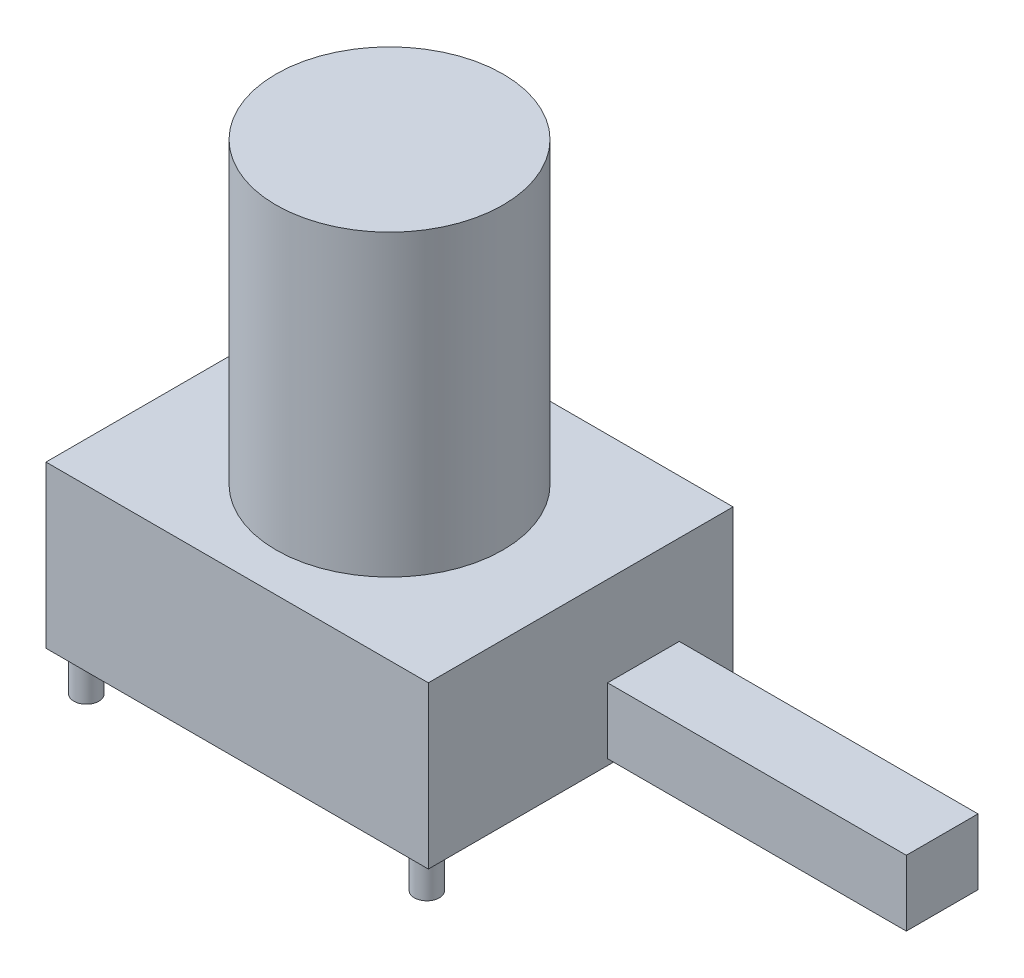
ISO-10303-21;
HEADER;
FILE_DESCRIPTION(('STEP AP214'),'2;1');
FILE_NAME('part.step','',(''),(''),'','','');
FILE_SCHEMA(('AUTOMOTIVE_DESIGN { 1 0 10303 214 1 1 1 1 }'));
ENDSEC;
DATA;
#1=APPLICATION_CONTEXT('core data for automotive mechanical design processes');
#2=APPLICATION_PROTOCOL_DEFINITION('international standard','automotive_design',2000,#1);
#3=PRODUCT_CONTEXT('',#1,'mechanical');
#4=PRODUCT('Part','Part','',(#3));
#5=PRODUCT_RELATED_PRODUCT_CATEGORY('part','',(#4));
#6=PRODUCT_DEFINITION_FORMATION('','',#4);
#7=PRODUCT_DEFINITION_CONTEXT('part definition',#1,'design');
#8=PRODUCT_DEFINITION('design','',#6,#7);
#9=PRODUCT_DEFINITION_SHAPE('','',#8);
#10=(LENGTH_UNIT() NAMED_UNIT(*) SI_UNIT(.MILLI.,.METRE.));
#11=(NAMED_UNIT(*) PLANE_ANGLE_UNIT() SI_UNIT($,.RADIAN.));
#12=(NAMED_UNIT(*) SI_UNIT($,.STERADIAN.) SOLID_ANGLE_UNIT());
#13=UNCERTAINTY_MEASURE_WITH_UNIT(LENGTH_MEASURE(1.E-05),#10,'distance_accuracy_value','');
#14=(GEOMETRIC_REPRESENTATION_CONTEXT(3) GLOBAL_UNCERTAINTY_ASSIGNED_CONTEXT((#13)) GLOBAL_UNIT_ASSIGNED_CONTEXT((#10,
#11,#12)) REPRESENTATION_CONTEXT('',''));
#15=CARTESIAN_POINT('',(0.,0.,0.));
#16=DIRECTION('',(0.,0.,1.));
#17=DIRECTION('',(1.,0.,0.));
#18=AXIS2_PLACEMENT_3D('',#15,#16,#17);
#19=CARTESIAN_POINT('',(64.,27.,0.));
#20=DIRECTION('',(-1.,0.,0.));
#21=DIRECTION('',(0.,0.,1.));
#22=AXIS2_PLACEMENT_3D('',#19,#20,#21);
#23=PLANE('',#22);
#24=DIRECTION('',(0.,0.,-1.));
#25=VECTOR('',#24,1.);
#26=CARTESIAN_POINT('',(64.,0.,0.));
#27=LINE('',#26,#25);
#28=CARTESIAN_POINT('',(64.,0.,0.));
#29=VERTEX_POINT('',#28);
#30=CARTESIAN_POINT('',(64.,0.,-51.));
#31=VERTEX_POINT('',#30);
#32=EDGE_CURVE('E180',#29,#31,#27,.T.);
#33=ORIENTED_EDGE('',*,*,#32,.T.);
#34=DIRECTION('',(0.,-1.,0.));
#35=VECTOR('',#34,1.);
#36=CARTESIAN_POINT('',(64.,27.,-51.));
#37=LINE('',#36,#35);
#38=CARTESIAN_POINT('',(64.,27.,-51.));
#39=VERTEX_POINT('',#38);
#40=EDGE_CURVE('E185',#39,#31,#37,.T.);
#41=ORIENTED_EDGE('',*,*,#40,.F.);
#42=DIRECTION('',(0.,0.,-1.));
#43=VECTOR('',#42,1.);
#44=CARTESIAN_POINT('',(64.,27.,0.));
#45=LINE('',#44,#43);
#46=CARTESIAN_POINT('',(64.,27.,0.));
#47=VERTEX_POINT('',#46);
#48=EDGE_CURVE('E171',#47,#39,#45,.T.);
#49=ORIENTED_EDGE('',*,*,#48,.F.);
#50=DIRECTION('',(0.,-1.,0.));
#51=VECTOR('',#50,1.);
#52=CARTESIAN_POINT('',(64.,27.,0.));
#53=LINE('',#52,#51);
#54=EDGE_CURVE('E188',#47,#29,#53,.T.);
#55=ORIENTED_EDGE('',*,*,#54,.T.);
#56=EDGE_LOOP('',(#33,#41,#49,#55));
#57=FACE_BOUND('',#56,.T.);
#58=DIRECTION('',(0.,1.,0.));
#59=VECTOR('',#58,1.);
#60=CARTESIAN_POINT('',(64.,1.,-42.));
#61=LINE('',#60,#59);
#62=CARTESIAN_POINT('',(64.,1.,-42.));
#63=VERTEX_POINT('',#62);
#64=CARTESIAN_POINT('',(64.,12.,-42.));
#65=VERTEX_POINT('',#64);
#66=EDGE_CURVE('E131',#63,#65,#61,.T.);
#67=ORIENTED_EDGE('',*,*,#66,.F.);
#68=DIRECTION('',(0.,0.,-1.));
#69=VECTOR('',#68,1.);
#70=CARTESIAN_POINT('',(64.,1.,-42.));
#71=LINE('',#70,#69);
#72=CARTESIAN_POINT('',(64.,1.,-30.));
#73=VERTEX_POINT('',#72);
#74=EDGE_CURVE('E128',#73,#63,#71,.T.);
#75=ORIENTED_EDGE('',*,*,#74,.F.);
#76=DIRECTION('',(0.,-1.,0.));
#77=VECTOR('',#76,1.);
#78=CARTESIAN_POINT('',(64.,0.999999999999999,-30.));
#79=LINE('',#78,#77);
#80=CARTESIAN_POINT('',(64.,12.,-30.));
#81=VERTEX_POINT('',#80);
#82=EDGE_CURVE('E66',#81,#73,#79,.T.);
#83=ORIENTED_EDGE('',*,*,#82,.F.);
#84=DIRECTION('',(0.,0.,1.));
#85=VECTOR('',#84,1.);
#86=CARTESIAN_POINT('',(64.,12.,-42.));
#87=LINE('',#86,#85);
#88=EDGE_CURVE('E61',#65,#81,#87,.T.);
#89=ORIENTED_EDGE('',*,*,#88,.F.);
#90=EDGE_LOOP('',(#67,#75,#83,#89));
#91=FACE_BOUND('',#90,.T.);
#92=ADVANCED_FACE('F46',(#57,#91),#23,.F.);
#93=CARTESIAN_POINT('',(0.,27.,0.));
#94=DIRECTION('',(1.,0.,0.));
#95=DIRECTION('',(0.,0.,-1.));
#96=AXIS2_PLACEMENT_3D('',#93,#94,#95);
#97=PLANE('',#96);
#98=DIRECTION('',(0.,0.,1.));
#99=VECTOR('',#98,1.);
#100=CARTESIAN_POINT('',(0.,0.,0.));
#101=LINE('',#100,#99);
#102=CARTESIAN_POINT('',(0.,0.,-51.));
#103=VERTEX_POINT('',#102);
#104=CARTESIAN_POINT('',(0.,0.,0.));
#105=VERTEX_POINT('',#104);
#106=EDGE_CURVE('E164',#103,#105,#101,.T.);
#107=ORIENTED_EDGE('',*,*,#106,.T.);
#108=DIRECTION('',(0.,-1.,0.));
#109=VECTOR('',#108,1.);
#110=CARTESIAN_POINT('',(0.,27.,0.));
#111=LINE('',#110,#109);
#112=CARTESIAN_POINT('',(0.,27.,0.));
#113=VERTEX_POINT('',#112);
#114=EDGE_CURVE('E54',#113,#105,#111,.T.);
#115=ORIENTED_EDGE('',*,*,#114,.F.);
#116=DIRECTION('',(0.,0.,1.));
#117=VECTOR('',#116,1.);
#118=CARTESIAN_POINT('',(0.,27.,0.));
#119=LINE('',#118,#117);
#120=CARTESIAN_POINT('',(0.,27.,-51.));
#121=VERTEX_POINT('',#120);
#122=EDGE_CURVE('E165',#121,#113,#119,.T.);
#123=ORIENTED_EDGE('',*,*,#122,.F.);
#124=DIRECTION('',(0.,-1.,0.));
#125=VECTOR('',#124,1.);
#126=CARTESIAN_POINT('',(0.,27.,-51.));
#127=LINE('',#126,#125);
#128=EDGE_CURVE('E175',#121,#103,#127,.T.);
#129=ORIENTED_EDGE('',*,*,#128,.T.);
#130=EDGE_LOOP('',(#107,#115,#123,#129));
#131=FACE_BOUND('',#130,.T.);
#132=ADVANCED_FACE('F48',(#131),#97,.F.);
#133=CARTESIAN_POINT('',(0.,27.,0.));
#134=DIRECTION('',(0.,0.,-1.));
#135=DIRECTION('',(-1.,0.,0.));
#136=AXIS2_PLACEMENT_3D('',#133,#134,#135);
#137=PLANE('',#136);
#138=DIRECTION('',(1.,0.,0.));
#139=VECTOR('',#138,1.);
#140=CARTESIAN_POINT('',(0.,0.,0.));
#141=LINE('',#140,#139);
#142=EDGE_CURVE('E178',#105,#29,#141,.T.);
#143=ORIENTED_EDGE('',*,*,#142,.T.);
#144=ORIENTED_EDGE('',*,*,#54,.F.);
#145=DIRECTION('',(1.,0.,0.));
#146=VECTOR('',#145,1.);
#147=CARTESIAN_POINT('',(0.,27.,0.));
#148=LINE('',#147,#146);
#149=EDGE_CURVE('E168',#113,#47,#148,.T.);
#150=ORIENTED_EDGE('',*,*,#149,.F.);
#151=ORIENTED_EDGE('',*,*,#114,.T.);
#152=EDGE_LOOP('',(#143,#144,#150,#151));
#153=FACE_BOUND('',#152,.T.);
#154=ADVANCED_FACE('F193',(#153),#137,.F.);
#155=CARTESIAN_POINT('',(0.,27.,-51.));
#156=DIRECTION('',(0.,0.,1.));
#157=DIRECTION('',(1.,0.,0.));
#158=AXIS2_PLACEMENT_3D('',#155,#156,#157);
#159=PLANE('',#158);
#160=DIRECTION('',(-1.,0.,0.));
#161=VECTOR('',#160,1.);
#162=CARTESIAN_POINT('',(0.,0.,-51.));
#163=LINE('',#162,#161);
#164=EDGE_CURVE('E169',#31,#103,#163,.T.);
#165=ORIENTED_EDGE('',*,*,#164,.T.);
#166=ORIENTED_EDGE('',*,*,#128,.F.);
#167=DIRECTION('',(-1.,0.,0.));
#168=VECTOR('',#167,1.);
#169=CARTESIAN_POINT('',(0.,27.,-51.));
#170=LINE('',#169,#168);
#171=EDGE_CURVE('E173',#39,#121,#170,.T.);
#172=ORIENTED_EDGE('',*,*,#171,.F.);
#173=ORIENTED_EDGE('',*,*,#40,.T.);
#174=EDGE_LOOP('',(#165,#166,#172,#173));
#175=FACE_BOUND('',#174,.T.);
#176=ADVANCED_FACE('F208',(#175),#159,.F.);
#177=CARTESIAN_POINT('',(0.,27.,0.));
#178=DIRECTION('',(0.,-1.,0.));
#179=DIRECTION('',(0.,0.,-1.));
#180=AXIS2_PLACEMENT_3D('',#177,#178,#179);
#181=PLANE('',#180);
#182=CARTESIAN_POINT('',(32.,27.,-25.5));
#183=DIRECTION('',(0.,-1.,0.));
#184=DIRECTION('',(0.,0.,-1.));
#185=AXIS2_PLACEMENT_3D('',#182,#183,#184);
#186=CIRCLE('',#185,19.);
#187=CARTESIAN_POINT('',(32.,27.,-44.5));
#188=VERTEX_POINT('',#187);
#189=EDGE_CURVE('E13',#188,#188,#186,.F.);
#190=ORIENTED_EDGE('',*,*,#189,.F.);
#191=EDGE_LOOP('',(#190));
#192=FACE_BOUND('',#191,.T.);
#193=ORIENTED_EDGE('',*,*,#122,.T.);
#194=ORIENTED_EDGE('',*,*,#149,.T.);
#195=ORIENTED_EDGE('',*,*,#48,.T.);
#196=ORIENTED_EDGE('',*,*,#171,.T.);
#197=EDGE_LOOP('',(#193,#194,#195,#196));
#198=FACE_BOUND('',#197,.T.);
#199=ADVANCED_FACE('F210',(#192,#198),#181,.F.);
#200=CARTESIAN_POINT('',(0.,0.,0.));
#201=DIRECTION('',(0.,-1.,0.));
#202=DIRECTION('',(0.,0.,-1.));
#203=AXIS2_PLACEMENT_3D('',#200,#201,#202);
#204=PLANE('',#203);
#205=CARTESIAN_POINT('',(60.5,0.,-47.75));
#206=DIRECTION('',(0.,-1.,0.));
#207=DIRECTION('',(0.,0.,-1.));
#208=AXIS2_PLACEMENT_3D('',#205,#206,#207);
#209=CIRCLE('',#208,2.09999999999999);
#210=CARTESIAN_POINT('',(60.5,0.,-45.65));
#211=VERTEX_POINT('',#210);
#212=EDGE_CURVE('E132',#211,#211,#209,.T.);
#213=ORIENTED_EDGE('',*,*,#212,.F.);
#214=EDGE_LOOP('',(#213));
#215=FACE_BOUND('',#214,.T.);
#216=CARTESIAN_POINT('',(3.49999999999999,0.,-47.75));
#217=DIRECTION('',(0.,-1.,0.));
#218=DIRECTION('',(0.,0.,-1.));
#219=AXIS2_PLACEMENT_3D('',#216,#217,#218);
#220=CIRCLE('',#219,2.1);
#221=CARTESIAN_POINT('',(3.49999999999999,0.,-45.65));
#222=VERTEX_POINT('',#221);
#223=EDGE_CURVE('E142',#222,#222,#220,.T.);
#224=ORIENTED_EDGE('',*,*,#223,.F.);
#225=EDGE_LOOP('',(#224));
#226=FACE_BOUND('',#225,.T.);
#227=CARTESIAN_POINT('',(60.5,0.,-3.25000000000001));
#228=DIRECTION('',(0.,-1.,0.));
#229=DIRECTION('',(0.,0.,-1.));
#230=AXIS2_PLACEMENT_3D('',#227,#228,#229);
#231=CIRCLE('',#230,2.09999999999999);
#232=CARTESIAN_POINT('',(60.5,0.,-1.15000000000002));
#233=VERTEX_POINT('',#232);
#234=EDGE_CURVE('E147',#233,#233,#231,.T.);
#235=ORIENTED_EDGE('',*,*,#234,.F.);
#236=EDGE_LOOP('',(#235));
#237=FACE_BOUND('',#236,.T.);
#238=CARTESIAN_POINT('',(3.49999999999999,0.,-3.25));
#239=DIRECTION('',(0.,-1.,0.));
#240=DIRECTION('',(0.,0.,-1.));
#241=AXIS2_PLACEMENT_3D('',#238,#239,#240);
#242=CIRCLE('',#241,2.1);
#243=CARTESIAN_POINT('',(3.49999999999999,0.,-1.15));
#244=VERTEX_POINT('',#243);
#245=EDGE_CURVE('E153',#244,#244,#242,.T.);
#246=ORIENTED_EDGE('',*,*,#245,.F.);
#247=EDGE_LOOP('',(#246));
#248=FACE_BOUND('',#247,.T.);
#249=ORIENTED_EDGE('',*,*,#106,.F.);
#250=ORIENTED_EDGE('',*,*,#164,.F.);
#251=ORIENTED_EDGE('',*,*,#32,.F.);
#252=ORIENTED_EDGE('',*,*,#142,.F.);
#253=EDGE_LOOP('',(#249,#250,#251,#252));
#254=FACE_BOUND('',#253,.T.);
#255=ADVANCED_FACE('F201',(#215,#226,#237,#248,#254),#204,.T.);
#256=CARTESIAN_POINT('',(32.,77.,-25.5));
#257=DIRECTION('',(0.,-1.,0.));
#258=DIRECTION('',(0.,0.,-1.));
#259=AXIS2_PLACEMENT_3D('',#256,#257,#258);
#260=CYLINDRICAL_SURFACE('',#259,19.);
#261=CARTESIAN_POINT('',(32.,77.,-25.5));
#262=DIRECTION('',(0.,1.,0.));
#263=DIRECTION('',(0.,0.,1.));
#264=AXIS2_PLACEMENT_3D('',#261,#262,#263);
#265=CIRCLE('',#264,19.);
#266=CARTESIAN_POINT('',(32.,77.,-6.5));
#267=VERTEX_POINT('',#266);
#268=EDGE_CURVE('E159',#267,#267,#265,.T.);
#269=ORIENTED_EDGE('',*,*,#268,.F.);
#270=EDGE_LOOP('',(#269));
#271=FACE_BOUND('',#270,.T.);
#272=ORIENTED_EDGE('',*,*,#189,.T.);
#273=EDGE_LOOP('',(#272));
#274=FACE_BOUND('',#273,.T.);
#275=ADVANCED_FACE('F218',(#271,#274),#260,.T.);
#276=CARTESIAN_POINT('',(32.,77.,-25.5));
#277=DIRECTION('',(0.,1.,0.));
#278=DIRECTION('',(0.,0.,1.));
#279=AXIS2_PLACEMENT_3D('',#276,#277,#278);
#280=PLANE('',#279);
#281=ORIENTED_EDGE('',*,*,#268,.T.);
#282=EDGE_LOOP('',(#281));
#283=FACE_BOUND('',#282,.T.);
#284=ADVANCED_FACE('F252',(#283),#280,.T.);
#285=CARTESIAN_POINT('',(3.49999999999999,-6.5,-3.25));
#286=DIRECTION('',(0.,1.,0.));
#287=DIRECTION('',(0.,0.,1.));
#288=AXIS2_PLACEMENT_3D('',#285,#286,#287);
#289=CYLINDRICAL_SURFACE('',#288,2.1);
#290=CARTESIAN_POINT('',(3.49999999999999,-6.5,-3.25));
#291=DIRECTION('',(0.,-1.,0.));
#292=DIRECTION('',(0.,0.,-1.));
#293=AXIS2_PLACEMENT_3D('',#290,#291,#292);
#294=CIRCLE('',#293,2.1);
#295=CARTESIAN_POINT('',(3.49999999999999,-6.5,-1.15));
#296=VERTEX_POINT('',#295);
#297=EDGE_CURVE('E156',#296,#296,#294,.T.);
#298=CARTESIAN_POINT('',(3.49999999999999,-6.5,-1.15));
#299=CARTESIAN_POINT('',(3.49999999999999,-6.43229166666667,-1.15));
#300=CARTESIAN_POINT('',(3.49999999999999,-6.36458333333333,-1.15));
#301=CARTESIAN_POINT('',(3.49999999999999,-6.22916666666667,-1.15));
#302=CARTESIAN_POINT('',(3.49999999999999,-6.16145833333333,-1.15));
#303=CARTESIAN_POINT('',(3.49999999999999,-6.02604166666667,-1.15));
#304=CARTESIAN_POINT('',(3.49999999999999,-5.95833333333333,-1.15));
#305=CARTESIAN_POINT('',(3.49999999999999,-5.82291666666667,-1.15));
#306=CARTESIAN_POINT('',(3.49999999999999,-5.75520833333333,-1.15));
#307=CARTESIAN_POINT('',(3.49999999999999,-5.61979166666667,-1.15));
#308=CARTESIAN_POINT('',(3.49999999999999,-5.55208333333333,-1.15));
#309=CARTESIAN_POINT('',(3.49999999999999,-5.41666666666667,-1.15));
#310=CARTESIAN_POINT('',(3.49999999999999,-5.34895833333333,-1.15));
#311=CARTESIAN_POINT('',(3.49999999999999,-5.21354166666667,-1.15));
#312=CARTESIAN_POINT('',(3.49999999999999,-5.14583333333333,-1.15));
#313=CARTESIAN_POINT('',(3.49999999999999,-5.01041666666667,-1.15));
#314=CARTESIAN_POINT('',(3.49999999999999,-4.94270833333333,-1.15));
#315=CARTESIAN_POINT('',(3.49999999999999,-4.80729166666667,-1.15));
#316=CARTESIAN_POINT('',(3.49999999999999,-4.73958333333333,-1.15));
#317=CARTESIAN_POINT('',(3.49999999999999,-4.60416666666667,-1.15));
#318=CARTESIAN_POINT('',(3.49999999999999,-4.53645833333333,-1.15));
#319=CARTESIAN_POINT('',(3.49999999999999,-4.40104166666667,-1.15));
#320=CARTESIAN_POINT('',(3.49999999999999,-4.33333333333333,-1.15));
#321=CARTESIAN_POINT('',(3.49999999999999,-4.19791666666667,-1.15));
#322=CARTESIAN_POINT('',(3.49999999999999,-4.13020833333333,-1.15));
#323=CARTESIAN_POINT('',(3.49999999999999,-3.99479166666667,-1.15));
#324=CARTESIAN_POINT('',(3.49999999999999,-3.92708333333333,-1.15));
#325=CARTESIAN_POINT('',(3.49999999999999,-3.79166666666667,-1.15));
#326=CARTESIAN_POINT('',(3.49999999999999,-3.72395833333333,-1.15));
#327=CARTESIAN_POINT('',(3.49999999999999,-3.58854166666667,-1.15));
#328=CARTESIAN_POINT('',(3.49999999999999,-3.52083333333333,-1.15));
#329=CARTESIAN_POINT('',(3.49999999999999,-3.38541666666667,-1.15));
#330=CARTESIAN_POINT('',(3.49999999999999,-3.31770833333333,-1.15));
#331=CARTESIAN_POINT('',(3.49999999999999,-3.18229166666667,-1.15));
#332=CARTESIAN_POINT('',(3.49999999999999,-3.11458333333333,-1.15));
#333=CARTESIAN_POINT('',(3.49999999999999,-2.97916666666667,-1.15));
#334=CARTESIAN_POINT('',(3.49999999999999,-2.91145833333333,-1.15));
#335=CARTESIAN_POINT('',(3.49999999999999,-2.77604166666667,-1.15));
#336=CARTESIAN_POINT('',(3.49999999999999,-2.70833333333333,-1.15));
#337=CARTESIAN_POINT('',(3.49999999999999,-2.57291666666667,-1.15));
#338=CARTESIAN_POINT('',(3.49999999999999,-2.50520833333333,-1.15));
#339=CARTESIAN_POINT('',(3.49999999999999,-2.36979166666667,-1.15));
#340=CARTESIAN_POINT('',(3.49999999999999,-2.30208333333333,-1.15));
#341=CARTESIAN_POINT('',(3.49999999999999,-2.16666666666667,-1.15));
#342=CARTESIAN_POINT('',(3.49999999999999,-2.09895833333333,-1.15));
#343=CARTESIAN_POINT('',(3.49999999999999,-1.96354166666667,-1.15));
#344=CARTESIAN_POINT('',(3.49999999999999,-1.89583333333333,-1.15));
#345=CARTESIAN_POINT('',(3.49999999999999,-1.76041666666667,-1.15));
#346=CARTESIAN_POINT('',(3.49999999999999,-1.69270833333333,-1.15));
#347=CARTESIAN_POINT('',(3.49999999999999,-1.55729166666667,-1.15));
#348=CARTESIAN_POINT('',(3.49999999999999,-1.48958333333333,-1.15));
#349=CARTESIAN_POINT('',(3.49999999999999,-1.35416666666667,-1.15));
#350=CARTESIAN_POINT('',(3.49999999999999,-1.28645833333333,-1.15));
#351=CARTESIAN_POINT('',(3.49999999999999,-1.15104166666667,-1.15));
#352=CARTESIAN_POINT('',(3.49999999999999,-1.08333333333333,-1.15));
#353=CARTESIAN_POINT('',(3.49999999999999,-0.947916666666667,-1.15));
#354=CARTESIAN_POINT('',(3.49999999999999,-0.880208333333333,-1.15));
#355=CARTESIAN_POINT('',(3.49999999999999,-0.744791666666667,-1.15));
#356=CARTESIAN_POINT('',(3.49999999999999,-0.677083333333333,-1.15));
#357=CARTESIAN_POINT('',(3.49999999999999,-0.541666666666667,-1.15));
#358=CARTESIAN_POINT('',(3.49999999999999,-0.473958333333333,-1.15));
#359=CARTESIAN_POINT('',(3.49999999999999,-0.338541666666667,-1.15));
#360=CARTESIAN_POINT('',(3.49999999999999,-0.270833333333334,-1.15));
#361=CARTESIAN_POINT('',(3.49999999999999,-0.135416666666667,-1.15));
#362=CARTESIAN_POINT('',(3.49999999999999,-0.0677083333333334,-1.15));
#363=CARTESIAN_POINT('',(3.49999999999999,0.,-1.15));
#364=B_SPLINE_CURVE_WITH_KNOTS('',3,(#298,#299,#300,#301,#302,#303,#304,#305,#306,#307,#308,
#309,#310,#311,#312,#313,#314,#315,#316,#317,#318,#319,#320,#321,#322,#323,#324,#325,#326,#327,
#328,#329,#330,#331,#332,#333,#334,#335,#336,#337,#338,#339,#340,#341,#342,#343,#344,#345,#346,
#347,#348,#349,#350,#351,#352,#353,#354,#355,#356,#357,#358,#359,#360,#361,#362,#363),
.UNSPECIFIED.,.F.,.F.,(4,2,2,2,2,2,2,2,2,2,2,2,2,2,2,2,2,2,2,2,2,2,2,2,2,2,2,2,2,2,2,2,4),(0.,
0.203125,0.40625,0.609375000000001,0.812500000000001,1.015625,1.21875,1.421875,1.625,1.828125,
2.03125,2.234375,2.4375,2.640625,2.84375,3.046875,3.25,3.453125,3.65625,3.859375,4.0625,
4.265625,4.46875,4.671875,4.875,5.078125,5.28125,5.484375,5.6875,5.890625,6.09375,6.296875,6.5),.UNSPECIFIED.);
#365=EDGE_CURVE('BSEAM261',#296,#244,#364,.T.);
#366=ORIENTED_EDGE('',*,*,#297,.F.);
#367=ORIENTED_EDGE('',*,*,#245,.T.);
#368=ORIENTED_EDGE('',*,*,#365,.T.);
#369=ORIENTED_EDGE('',*,*,#365,.F.);
#370=EDGE_LOOP('',(#366,#368,#367,#369));
#371=FACE_BOUND('',#370,.T.);
#372=ADVANCED_FACE('F261',(#371),#289,.T.);
#373=CARTESIAN_POINT('',(3.49999999999999,-6.5,-3.25));
#374=DIRECTION('',(0.,-1.,0.));
#375=DIRECTION('',(0.,0.,-1.));
#376=AXIS2_PLACEMENT_3D('',#373,#374,#375);
#377=PLANE('',#376);
#378=ORIENTED_EDGE('',*,*,#297,.T.);
#379=EDGE_LOOP('',(#378));
#380=FACE_BOUND('',#379,.T.);
#381=ADVANCED_FACE('F276',(#380),#377,.T.);
#382=CARTESIAN_POINT('',(60.5,-6.5,-3.25000000000001));
#383=DIRECTION('',(0.,1.,0.));
#384=DIRECTION('',(0.,0.,1.));
#385=AXIS2_PLACEMENT_3D('',#382,#383,#384);
#386=CYLINDRICAL_SURFACE('',#385,2.09999999999999);
#387=CARTESIAN_POINT('',(60.5,-6.5,-3.25000000000001));
#388=DIRECTION('',(0.,-1.,0.));
#389=DIRECTION('',(0.,0.,-1.));
#390=AXIS2_PLACEMENT_3D('',#387,#388,#389);
#391=CIRCLE('',#390,2.09999999999999);
#392=CARTESIAN_POINT('',(60.5,-6.5,-1.15000000000002));
#393=VERTEX_POINT('',#392);
#394=EDGE_CURVE('E150',#393,#393,#391,.T.);
#395=CARTESIAN_POINT('',(60.5,-6.5,-1.15000000000002));
#396=CARTESIAN_POINT('',(60.5,-6.43229166666667,-1.15000000000002));
#397=CARTESIAN_POINT('',(60.5,-6.36458333333333,-1.15000000000002));
#398=CARTESIAN_POINT('',(60.5,-6.22916666666667,-1.15000000000002));
#399=CARTESIAN_POINT('',(60.5,-6.16145833333333,-1.15000000000002));
#400=CARTESIAN_POINT('',(60.5,-6.02604166666667,-1.15000000000002));
#401=CARTESIAN_POINT('',(60.5,-5.95833333333333,-1.15000000000002));
#402=CARTESIAN_POINT('',(60.5,-5.82291666666667,-1.15000000000002));
#403=CARTESIAN_POINT('',(60.5,-5.75520833333333,-1.15000000000002));
#404=CARTESIAN_POINT('',(60.5,-5.61979166666667,-1.15000000000002));
#405=CARTESIAN_POINT('',(60.5,-5.55208333333333,-1.15000000000002));
#406=CARTESIAN_POINT('',(60.5,-5.41666666666667,-1.15000000000002));
#407=CARTESIAN_POINT('',(60.5,-5.34895833333333,-1.15000000000002));
#408=CARTESIAN_POINT('',(60.5,-5.21354166666667,-1.15000000000002));
#409=CARTESIAN_POINT('',(60.5,-5.14583333333333,-1.15000000000002));
#410=CARTESIAN_POINT('',(60.5,-5.01041666666667,-1.15000000000002));
#411=CARTESIAN_POINT('',(60.5,-4.94270833333333,-1.15000000000002));
#412=CARTESIAN_POINT('',(60.5,-4.80729166666667,-1.15000000000002));
#413=CARTESIAN_POINT('',(60.5,-4.73958333333333,-1.15000000000002));
#414=CARTESIAN_POINT('',(60.5,-4.60416666666667,-1.15000000000002));
#415=CARTESIAN_POINT('',(60.5,-4.53645833333333,-1.15000000000002));
#416=CARTESIAN_POINT('',(60.5,-4.40104166666667,-1.15000000000002));
#417=CARTESIAN_POINT('',(60.5,-4.33333333333333,-1.15000000000002));
#418=CARTESIAN_POINT('',(60.5,-4.19791666666667,-1.15000000000002));
#419=CARTESIAN_POINT('',(60.5,-4.13020833333333,-1.15000000000002));
#420=CARTESIAN_POINT('',(60.5,-3.99479166666667,-1.15000000000002));
#421=CARTESIAN_POINT('',(60.5,-3.92708333333333,-1.15000000000002));
#422=CARTESIAN_POINT('',(60.5,-3.79166666666667,-1.15000000000002));
#423=CARTESIAN_POINT('',(60.5,-3.72395833333333,-1.15000000000002));
#424=CARTESIAN_POINT('',(60.5,-3.58854166666667,-1.15000000000002));
#425=CARTESIAN_POINT('',(60.5,-3.52083333333333,-1.15000000000002));
#426=CARTESIAN_POINT('',(60.5,-3.38541666666667,-1.15000000000002));
#427=CARTESIAN_POINT('',(60.5,-3.31770833333333,-1.15000000000002));
#428=CARTESIAN_POINT('',(60.5,-3.18229166666667,-1.15000000000002));
#429=CARTESIAN_POINT('',(60.5,-3.11458333333333,-1.15000000000002));
#430=CARTESIAN_POINT('',(60.5,-2.97916666666667,-1.15000000000002));
#431=CARTESIAN_POINT('',(60.5,-2.91145833333333,-1.15000000000002));
#432=CARTESIAN_POINT('',(60.5,-2.77604166666667,-1.15000000000002));
#433=CARTESIAN_POINT('',(60.5,-2.70833333333333,-1.15000000000002));
#434=CARTESIAN_POINT('',(60.5,-2.57291666666667,-1.15000000000002));
#435=CARTESIAN_POINT('',(60.5,-2.50520833333333,-1.15000000000002));
#436=CARTESIAN_POINT('',(60.5,-2.36979166666667,-1.15000000000002));
#437=CARTESIAN_POINT('',(60.5,-2.30208333333333,-1.15000000000002));
#438=CARTESIAN_POINT('',(60.5,-2.16666666666667,-1.15000000000002));
#439=CARTESIAN_POINT('',(60.5,-2.09895833333333,-1.15000000000002));
#440=CARTESIAN_POINT('',(60.5,-1.96354166666667,-1.15000000000002));
#441=CARTESIAN_POINT('',(60.5,-1.89583333333333,-1.15000000000002));
#442=CARTESIAN_POINT('',(60.5,-1.76041666666667,-1.15000000000002));
#443=CARTESIAN_POINT('',(60.5,-1.69270833333333,-1.15000000000002));
#444=CARTESIAN_POINT('',(60.5,-1.55729166666667,-1.15000000000002));
#445=CARTESIAN_POINT('',(60.5,-1.48958333333333,-1.15000000000002));
#446=CARTESIAN_POINT('',(60.5,-1.35416666666667,-1.15000000000002));
#447=CARTESIAN_POINT('',(60.5,-1.28645833333333,-1.15000000000002));
#448=CARTESIAN_POINT('',(60.5,-1.15104166666667,-1.15000000000002));
#449=CARTESIAN_POINT('',(60.5,-1.08333333333333,-1.15000000000002));
#450=CARTESIAN_POINT('',(60.5,-0.947916666666667,-1.15000000000002));
#451=CARTESIAN_POINT('',(60.5,-0.880208333333333,-1.15000000000002));
#452=CARTESIAN_POINT('',(60.5,-0.744791666666667,-1.15000000000002));
#453=CARTESIAN_POINT('',(60.5,-0.677083333333333,-1.15000000000002));
#454=CARTESIAN_POINT('',(60.5,-0.541666666666667,-1.15000000000002));
#455=CARTESIAN_POINT('',(60.5,-0.473958333333333,-1.15000000000002));
#456=CARTESIAN_POINT('',(60.5,-0.338541666666667,-1.15000000000002));
#457=CARTESIAN_POINT('',(60.5,-0.270833333333334,-1.15000000000002));
#458=CARTESIAN_POINT('',(60.5,-0.135416666666667,-1.15000000000002));
#459=CARTESIAN_POINT('',(60.5,-0.0677083333333334,-1.15000000000002));
#460=CARTESIAN_POINT('',(60.5,0.,-1.15000000000002));
#461=B_SPLINE_CURVE_WITH_KNOTS('',3,(#395,#396,#397,#398,#399,#400,#401,#402,#403,#404,#405,
#406,#407,#408,#409,#410,#411,#412,#413,#414,#415,#416,#417,#418,#419,#420,#421,#422,#423,#424,
#425,#426,#427,#428,#429,#430,#431,#432,#433,#434,#435,#436,#437,#438,#439,#440,#441,#442,#443,
#444,#445,#446,#447,#448,#449,#450,#451,#452,#453,#454,#455,#456,#457,#458,#459,#460),
.UNSPECIFIED.,.F.,.F.,(4,2,2,2,2,2,2,2,2,2,2,2,2,2,2,2,2,2,2,2,2,2,2,2,2,2,2,2,2,2,2,2,4),(0.,
0.203125,0.40625,0.609375000000001,0.812500000000001,1.015625,1.21875,1.421875,1.625,1.828125,
2.03125,2.234375,2.4375,2.640625,2.84375,3.046875,3.25,3.453125,3.65625,3.859375,4.0625,
4.265625,4.46875,4.671875,4.875,5.078125,5.28125,5.484375,5.6875,5.890625,6.09375,6.296875,6.5),.UNSPECIFIED.);
#462=EDGE_CURVE('BSEAM286',#393,#233,#461,.T.);
#463=ORIENTED_EDGE('',*,*,#394,.F.);
#464=ORIENTED_EDGE('',*,*,#234,.T.);
#465=ORIENTED_EDGE('',*,*,#462,.T.);
#466=ORIENTED_EDGE('',*,*,#462,.F.);
#467=EDGE_LOOP('',(#463,#465,#464,#466));
#468=FACE_BOUND('',#467,.T.);
#469=ADVANCED_FACE('F286',(#468),#386,.T.);
#470=CARTESIAN_POINT('',(60.5,-6.5,-3.25000000000001));
#471=DIRECTION('',(0.,-1.,0.));
#472=DIRECTION('',(0.,0.,-1.));
#473=AXIS2_PLACEMENT_3D('',#470,#471,#472);
#474=PLANE('',#473);
#475=ORIENTED_EDGE('',*,*,#394,.T.);
#476=EDGE_LOOP('',(#475));
#477=FACE_BOUND('',#476,.T.);
#478=ADVANCED_FACE('F296',(#477),#474,.T.);
#479=CARTESIAN_POINT('',(3.49999999999999,-6.5,-47.75));
#480=DIRECTION('',(0.,1.,0.));
#481=DIRECTION('',(0.,0.,1.));
#482=AXIS2_PLACEMENT_3D('',#479,#480,#481);
#483=CYLINDRICAL_SURFACE('',#482,2.1);
#484=CARTESIAN_POINT('',(3.49999999999999,-6.5,-47.75));
#485=DIRECTION('',(0.,-1.,0.));
#486=DIRECTION('',(0.,0.,-1.));
#487=AXIS2_PLACEMENT_3D('',#484,#485,#486);
#488=CIRCLE('',#487,2.1);
#489=CARTESIAN_POINT('',(3.49999999999999,-6.5,-45.65));
#490=VERTEX_POINT('',#489);
#491=EDGE_CURVE('E144',#490,#490,#488,.T.);
#492=CARTESIAN_POINT('',(3.49999999999999,-6.5,-45.65));
#493=CARTESIAN_POINT('',(3.49999999999999,-6.43229166666667,-45.65));
#494=CARTESIAN_POINT('',(3.49999999999999,-6.36458333333333,-45.65));
#495=CARTESIAN_POINT('',(3.49999999999999,-6.22916666666667,-45.65));
#496=CARTESIAN_POINT('',(3.49999999999999,-6.16145833333333,-45.65));
#497=CARTESIAN_POINT('',(3.49999999999999,-6.02604166666667,-45.65));
#498=CARTESIAN_POINT('',(3.49999999999999,-5.95833333333333,-45.65));
#499=CARTESIAN_POINT('',(3.49999999999999,-5.82291666666667,-45.65));
#500=CARTESIAN_POINT('',(3.49999999999999,-5.75520833333333,-45.65));
#501=CARTESIAN_POINT('',(3.49999999999999,-5.61979166666667,-45.65));
#502=CARTESIAN_POINT('',(3.49999999999999,-5.55208333333333,-45.65));
#503=CARTESIAN_POINT('',(3.49999999999999,-5.41666666666667,-45.65));
#504=CARTESIAN_POINT('',(3.49999999999999,-5.34895833333333,-45.65));
#505=CARTESIAN_POINT('',(3.49999999999999,-5.21354166666667,-45.65));
#506=CARTESIAN_POINT('',(3.49999999999999,-5.14583333333333,-45.65));
#507=CARTESIAN_POINT('',(3.49999999999999,-5.01041666666667,-45.65));
#508=CARTESIAN_POINT('',(3.49999999999999,-4.94270833333333,-45.65));
#509=CARTESIAN_POINT('',(3.49999999999999,-4.80729166666667,-45.65));
#510=CARTESIAN_POINT('',(3.49999999999999,-4.73958333333333,-45.65));
#511=CARTESIAN_POINT('',(3.49999999999999,-4.60416666666667,-45.65));
#512=CARTESIAN_POINT('',(3.49999999999999,-4.53645833333333,-45.65));
#513=CARTESIAN_POINT('',(3.49999999999999,-4.40104166666667,-45.65));
#514=CARTESIAN_POINT('',(3.49999999999999,-4.33333333333333,-45.65));
#515=CARTESIAN_POINT('',(3.49999999999999,-4.19791666666667,-45.65));
#516=CARTESIAN_POINT('',(3.49999999999999,-4.13020833333333,-45.65));
#517=CARTESIAN_POINT('',(3.49999999999999,-3.99479166666667,-45.65));
#518=CARTESIAN_POINT('',(3.49999999999999,-3.92708333333333,-45.65));
#519=CARTESIAN_POINT('',(3.49999999999999,-3.79166666666667,-45.65));
#520=CARTESIAN_POINT('',(3.49999999999999,-3.72395833333333,-45.65));
#521=CARTESIAN_POINT('',(3.49999999999999,-3.58854166666667,-45.65));
#522=CARTESIAN_POINT('',(3.49999999999999,-3.52083333333333,-45.65));
#523=CARTESIAN_POINT('',(3.49999999999999,-3.38541666666667,-45.65));
#524=CARTESIAN_POINT('',(3.49999999999999,-3.31770833333333,-45.65));
#525=CARTESIAN_POINT('',(3.49999999999999,-3.18229166666667,-45.65));
#526=CARTESIAN_POINT('',(3.49999999999999,-3.11458333333333,-45.65));
#527=CARTESIAN_POINT('',(3.49999999999999,-2.97916666666667,-45.65));
#528=CARTESIAN_POINT('',(3.49999999999999,-2.91145833333333,-45.65));
#529=CARTESIAN_POINT('',(3.49999999999999,-2.77604166666667,-45.65));
#530=CARTESIAN_POINT('',(3.49999999999999,-2.70833333333333,-45.65));
#531=CARTESIAN_POINT('',(3.49999999999999,-2.57291666666667,-45.65));
#532=CARTESIAN_POINT('',(3.49999999999999,-2.50520833333333,-45.65));
#533=CARTESIAN_POINT('',(3.49999999999999,-2.36979166666667,-45.65));
#534=CARTESIAN_POINT('',(3.49999999999999,-2.30208333333333,-45.65));
#535=CARTESIAN_POINT('',(3.49999999999999,-2.16666666666667,-45.65));
#536=CARTESIAN_POINT('',(3.49999999999999,-2.09895833333333,-45.65));
#537=CARTESIAN_POINT('',(3.49999999999999,-1.96354166666667,-45.65));
#538=CARTESIAN_POINT('',(3.49999999999999,-1.89583333333333,-45.65));
#539=CARTESIAN_POINT('',(3.49999999999999,-1.76041666666667,-45.65));
#540=CARTESIAN_POINT('',(3.49999999999999,-1.69270833333333,-45.65));
#541=CARTESIAN_POINT('',(3.49999999999999,-1.55729166666667,-45.65));
#542=CARTESIAN_POINT('',(3.49999999999999,-1.48958333333333,-45.65));
#543=CARTESIAN_POINT('',(3.49999999999999,-1.35416666666667,-45.65));
#544=CARTESIAN_POINT('',(3.49999999999999,-1.28645833333333,-45.65));
#545=CARTESIAN_POINT('',(3.49999999999999,-1.15104166666667,-45.65));
#546=CARTESIAN_POINT('',(3.49999999999999,-1.08333333333333,-45.65));
#547=CARTESIAN_POINT('',(3.49999999999999,-0.947916666666667,-45.65));
#548=CARTESIAN_POINT('',(3.49999999999999,-0.880208333333333,-45.65));
#549=CARTESIAN_POINT('',(3.49999999999999,-0.744791666666667,-45.65));
#550=CARTESIAN_POINT('',(3.49999999999999,-0.677083333333333,-45.65));
#551=CARTESIAN_POINT('',(3.49999999999999,-0.541666666666667,-45.65));
#552=CARTESIAN_POINT('',(3.49999999999999,-0.473958333333333,-45.65));
#553=CARTESIAN_POINT('',(3.49999999999999,-0.338541666666667,-45.65));
#554=CARTESIAN_POINT('',(3.49999999999999,-0.270833333333334,-45.65));
#555=CARTESIAN_POINT('',(3.49999999999999,-0.135416666666667,-45.65));
#556=CARTESIAN_POINT('',(3.49999999999999,-0.0677083333333334,-45.65));
#557=CARTESIAN_POINT('',(3.49999999999999,0.,-45.65));
#558=B_SPLINE_CURVE_WITH_KNOTS('',3,(#492,#493,#494,#495,#496,#497,#498,#499,#500,#501,#502,
#503,#504,#505,#506,#507,#508,#509,#510,#511,#512,#513,#514,#515,#516,#517,#518,#519,#520,#521,
#522,#523,#524,#525,#526,#527,#528,#529,#530,#531,#532,#533,#534,#535,#536,#537,#538,#539,#540,
#541,#542,#543,#544,#545,#546,#547,#548,#549,#550,#551,#552,#553,#554,#555,#556,#557),
.UNSPECIFIED.,.F.,.F.,(4,2,2,2,2,2,2,2,2,2,2,2,2,2,2,2,2,2,2,2,2,2,2,2,2,2,2,2,2,2,2,2,4),(0.,
0.203125,0.40625,0.609375000000001,0.812500000000001,1.015625,1.21875,1.421875,1.625,1.828125,
2.03125,2.234375,2.4375,2.640625,2.84375,3.046875,3.25,3.453125,3.65625,3.859375,4.0625,
4.265625,4.46875,4.671875,4.875,5.078125,5.28125,5.484375,5.6875,5.890625,6.09375,6.296875,6.5),.UNSPECIFIED.);
#559=EDGE_CURVE('BSEAM306',#490,#222,#558,.T.);
#560=ORIENTED_EDGE('',*,*,#491,.F.);
#561=ORIENTED_EDGE('',*,*,#223,.T.);
#562=ORIENTED_EDGE('',*,*,#559,.T.);
#563=ORIENTED_EDGE('',*,*,#559,.F.);
#564=EDGE_LOOP('',(#560,#562,#561,#563));
#565=FACE_BOUND('',#564,.T.);
#566=ADVANCED_FACE('F306',(#565),#483,.T.);
#567=CARTESIAN_POINT('',(3.49999999999999,-6.5,-47.75));
#568=DIRECTION('',(0.,-1.,0.));
#569=DIRECTION('',(0.,0.,-1.));
#570=AXIS2_PLACEMENT_3D('',#567,#568,#569);
#571=PLANE('',#570);
#572=ORIENTED_EDGE('',*,*,#491,.T.);
#573=EDGE_LOOP('',(#572));
#574=FACE_BOUND('',#573,.T.);
#575=ADVANCED_FACE('F316',(#574),#571,.T.);
#576=CARTESIAN_POINT('',(60.5,-6.5,-47.75));
#577=DIRECTION('',(0.,1.,0.));
#578=DIRECTION('',(0.,0.,1.));
#579=AXIS2_PLACEMENT_3D('',#576,#577,#578);
#580=CYLINDRICAL_SURFACE('',#579,2.09999999999999);
#581=CARTESIAN_POINT('',(60.5,-6.5,-47.75));
#582=DIRECTION('',(0.,-1.,0.));
#583=DIRECTION('',(0.,0.,-1.));
#584=AXIS2_PLACEMENT_3D('',#581,#582,#583);
#585=CIRCLE('',#584,2.09999999999999);
#586=CARTESIAN_POINT('',(60.5,-6.5,-45.65));
#587=VERTEX_POINT('',#586);
#588=EDGE_CURVE('E135',#587,#587,#585,.T.);
#589=CARTESIAN_POINT('',(60.5,-6.5,-45.65));
#590=CARTESIAN_POINT('',(60.5,-6.43229166666667,-45.65));
#591=CARTESIAN_POINT('',(60.5,-6.36458333333333,-45.65));
#592=CARTESIAN_POINT('',(60.5,-6.22916666666667,-45.65));
#593=CARTESIAN_POINT('',(60.5,-6.16145833333333,-45.65));
#594=CARTESIAN_POINT('',(60.5,-6.02604166666667,-45.65));
#595=CARTESIAN_POINT('',(60.5,-5.95833333333333,-45.65));
#596=CARTESIAN_POINT('',(60.5,-5.82291666666667,-45.65));
#597=CARTESIAN_POINT('',(60.5,-5.75520833333333,-45.65));
#598=CARTESIAN_POINT('',(60.5,-5.61979166666667,-45.65));
#599=CARTESIAN_POINT('',(60.5,-5.55208333333333,-45.65));
#600=CARTESIAN_POINT('',(60.5,-5.41666666666667,-45.65));
#601=CARTESIAN_POINT('',(60.5,-5.34895833333333,-45.65));
#602=CARTESIAN_POINT('',(60.5,-5.21354166666667,-45.65));
#603=CARTESIAN_POINT('',(60.5,-5.14583333333333,-45.65));
#604=CARTESIAN_POINT('',(60.5,-5.01041666666667,-45.65));
#605=CARTESIAN_POINT('',(60.5,-4.94270833333333,-45.65));
#606=CARTESIAN_POINT('',(60.5,-4.80729166666667,-45.65));
#607=CARTESIAN_POINT('',(60.5,-4.73958333333333,-45.65));
#608=CARTESIAN_POINT('',(60.5,-4.60416666666667,-45.65));
#609=CARTESIAN_POINT('',(60.5,-4.53645833333333,-45.65));
#610=CARTESIAN_POINT('',(60.5,-4.40104166666667,-45.65));
#611=CARTESIAN_POINT('',(60.5,-4.33333333333333,-45.65));
#612=CARTESIAN_POINT('',(60.5,-4.19791666666667,-45.65));
#613=CARTESIAN_POINT('',(60.5,-4.13020833333333,-45.65));
#614=CARTESIAN_POINT('',(60.5,-3.99479166666667,-45.65));
#615=CARTESIAN_POINT('',(60.5,-3.92708333333333,-45.65));
#616=CARTESIAN_POINT('',(60.5,-3.79166666666667,-45.65));
#617=CARTESIAN_POINT('',(60.5,-3.72395833333333,-45.65));
#618=CARTESIAN_POINT('',(60.5,-3.58854166666667,-45.65));
#619=CARTESIAN_POINT('',(60.5,-3.52083333333333,-45.65));
#620=CARTESIAN_POINT('',(60.5,-3.38541666666667,-45.65));
#621=CARTESIAN_POINT('',(60.5,-3.31770833333333,-45.65));
#622=CARTESIAN_POINT('',(60.5,-3.18229166666667,-45.65));
#623=CARTESIAN_POINT('',(60.5,-3.11458333333333,-45.65));
#624=CARTESIAN_POINT('',(60.5,-2.97916666666667,-45.65));
#625=CARTESIAN_POINT('',(60.5,-2.91145833333333,-45.65));
#626=CARTESIAN_POINT('',(60.5,-2.77604166666667,-45.65));
#627=CARTESIAN_POINT('',(60.5,-2.70833333333333,-45.65));
#628=CARTESIAN_POINT('',(60.5,-2.57291666666667,-45.65));
#629=CARTESIAN_POINT('',(60.5,-2.50520833333333,-45.65));
#630=CARTESIAN_POINT('',(60.5,-2.36979166666667,-45.65));
#631=CARTESIAN_POINT('',(60.5,-2.30208333333333,-45.65));
#632=CARTESIAN_POINT('',(60.5,-2.16666666666667,-45.65));
#633=CARTESIAN_POINT('',(60.5,-2.09895833333333,-45.65));
#634=CARTESIAN_POINT('',(60.5,-1.96354166666667,-45.65));
#635=CARTESIAN_POINT('',(60.5,-1.89583333333333,-45.65));
#636=CARTESIAN_POINT('',(60.5,-1.76041666666667,-45.65));
#637=CARTESIAN_POINT('',(60.5,-1.69270833333333,-45.65));
#638=CARTESIAN_POINT('',(60.5,-1.55729166666667,-45.65));
#639=CARTESIAN_POINT('',(60.5,-1.48958333333333,-45.65));
#640=CARTESIAN_POINT('',(60.5,-1.35416666666667,-45.65));
#641=CARTESIAN_POINT('',(60.5,-1.28645833333333,-45.65));
#642=CARTESIAN_POINT('',(60.5,-1.15104166666667,-45.65));
#643=CARTESIAN_POINT('',(60.5,-1.08333333333333,-45.65));
#644=CARTESIAN_POINT('',(60.5,-0.947916666666667,-45.65));
#645=CARTESIAN_POINT('',(60.5,-0.880208333333333,-45.65));
#646=CARTESIAN_POINT('',(60.5,-0.744791666666667,-45.65));
#647=CARTESIAN_POINT('',(60.5,-0.677083333333333,-45.65));
#648=CARTESIAN_POINT('',(60.5,-0.541666666666667,-45.65));
#649=CARTESIAN_POINT('',(60.5,-0.473958333333333,-45.65));
#650=CARTESIAN_POINT('',(60.5,-0.338541666666667,-45.65));
#651=CARTESIAN_POINT('',(60.5,-0.270833333333334,-45.65));
#652=CARTESIAN_POINT('',(60.5,-0.135416666666667,-45.65));
#653=CARTESIAN_POINT('',(60.5,-0.0677083333333334,-45.65));
#654=CARTESIAN_POINT('',(60.5,0.,-45.65));
#655=B_SPLINE_CURVE_WITH_KNOTS('',3,(#589,#590,#591,#592,#593,#594,#595,#596,#597,#598,#599,
#600,#601,#602,#603,#604,#605,#606,#607,#608,#609,#610,#611,#612,#613,#614,#615,#616,#617,#618,
#619,#620,#621,#622,#623,#624,#625,#626,#627,#628,#629,#630,#631,#632,#633,#634,#635,#636,#637,
#638,#639,#640,#641,#642,#643,#644,#645,#646,#647,#648,#649,#650,#651,#652,#653,#654),
.UNSPECIFIED.,.F.,.F.,(4,2,2,2,2,2,2,2,2,2,2,2,2,2,2,2,2,2,2,2,2,2,2,2,2,2,2,2,2,2,2,2,4),(0.,
0.203125,0.40625,0.609375000000001,0.812500000000001,1.015625,1.21875,1.421875,1.625,1.828125,
2.03125,2.234375,2.4375,2.640625,2.84375,3.046875,3.25,3.453125,3.65625,3.859375,4.0625,
4.265625,4.46875,4.671875,4.875,5.078125,5.28125,5.484375,5.6875,5.890625,6.09375,6.296875,6.5),.UNSPECIFIED.);
#656=EDGE_CURVE('BSEAM326',#587,#211,#655,.T.);
#657=ORIENTED_EDGE('',*,*,#588,.F.);
#658=ORIENTED_EDGE('',*,*,#212,.T.);
#659=ORIENTED_EDGE('',*,*,#656,.T.);
#660=ORIENTED_EDGE('',*,*,#656,.F.);
#661=EDGE_LOOP('',(#657,#659,#658,#660));
#662=FACE_BOUND('',#661,.T.);
#663=ADVANCED_FACE('F326',(#662),#580,.T.);
#664=CARTESIAN_POINT('',(60.5,-6.5,-47.75));
#665=DIRECTION('',(0.,-1.,0.));
#666=DIRECTION('',(0.,0.,-1.));
#667=AXIS2_PLACEMENT_3D('',#664,#665,#666);
#668=PLANE('',#667);
#669=ORIENTED_EDGE('',*,*,#588,.T.);
#670=EDGE_LOOP('',(#669));
#671=FACE_BOUND('',#670,.T.);
#672=ADVANCED_FACE('F336',(#671),#668,.T.);
#673=CARTESIAN_POINT('',(114.,1.,-42.));
#674=DIRECTION('',(0.,0.,1.));
#675=DIRECTION('',(1.,0.,0.));
#676=AXIS2_PLACEMENT_3D('',#673,#674,#675);
#677=PLANE('',#676);
#678=ORIENTED_EDGE('',*,*,#66,.T.);
#679=DIRECTION('',(-1.,0.,0.));
#680=VECTOR('',#679,1.);
#681=CARTESIAN_POINT('',(114.,12.,-42.));
#682=LINE('',#681,#680);
#683=CARTESIAN_POINT('',(114.,12.,-42.));
#684=VERTEX_POINT('',#683);
#685=EDGE_CURVE('E112',#684,#65,#682,.T.);
#686=ORIENTED_EDGE('',*,*,#685,.F.);
#687=DIRECTION('',(0.,1.,0.));
#688=VECTOR('',#687,1.);
#689=CARTESIAN_POINT('',(114.,1.,-42.));
#690=LINE('',#689,#688);
#691=CARTESIAN_POINT('',(114.,1.,-42.));
#692=VERTEX_POINT('',#691);
#693=EDGE_CURVE('E119',#692,#684,#690,.T.);
#694=ORIENTED_EDGE('',*,*,#693,.F.);
#695=DIRECTION('',(-1.,0.,0.));
#696=VECTOR('',#695,1.);
#697=CARTESIAN_POINT('',(114.,1.,-42.));
#698=LINE('',#697,#696);
#699=EDGE_CURVE('E400',#692,#63,#698,.T.);
#700=ORIENTED_EDGE('',*,*,#699,.T.);
#701=EDGE_LOOP('',(#678,#686,#694,#700));
#702=FACE_BOUND('',#701,.T.);
#703=ADVANCED_FACE('F130',(#702),#677,.F.);
#704=CARTESIAN_POINT('',(114.,12.,-42.));
#705=DIRECTION('',(0.,-1.,0.));
#706=DIRECTION('',(0.,0.,-1.));
#707=AXIS2_PLACEMENT_3D('',#704,#705,#706);
#708=PLANE('',#707);
#709=ORIENTED_EDGE('',*,*,#88,.T.);
#710=DIRECTION('',(-1.,0.,0.));
#711=VECTOR('',#710,1.);
#712=CARTESIAN_POINT('',(114.,12.,-30.));
#713=LINE('',#712,#711);
#714=CARTESIAN_POINT('',(114.,12.,-30.));
#715=VERTEX_POINT('',#714);
#716=EDGE_CURVE('E115',#715,#81,#713,.T.);
#717=ORIENTED_EDGE('',*,*,#716,.F.);
#718=DIRECTION('',(0.,0.,1.));
#719=VECTOR('',#718,1.);
#720=CARTESIAN_POINT('',(114.,12.,-42.));
#721=LINE('',#720,#719);
#722=EDGE_CURVE('E108',#684,#715,#721,.T.);
#723=ORIENTED_EDGE('',*,*,#722,.F.);
#724=ORIENTED_EDGE('',*,*,#685,.T.);
#725=EDGE_LOOP('',(#709,#717,#723,#724));
#726=FACE_BOUND('',#725,.T.);
#727=ADVANCED_FACE('F110',(#726),#708,.F.);
#728=CARTESIAN_POINT('',(114.,0.999999999999999,-30.));
#729=DIRECTION('',(0.,0.,-1.));
#730=DIRECTION('',(-1.,0.,0.));
#731=AXIS2_PLACEMENT_3D('',#728,#729,#730);
#732=PLANE('',#731);
#733=ORIENTED_EDGE('',*,*,#82,.T.);
#734=DIRECTION('',(-1.,0.,0.));
#735=VECTOR('',#734,1.);
#736=CARTESIAN_POINT('',(114.,0.999999999999999,-30.));
#737=LINE('',#736,#735);
#738=CARTESIAN_POINT('',(114.,0.999999999999999,-30.));
#739=VERTEX_POINT('',#738);
#740=EDGE_CURVE('E137',#739,#73,#737,.T.);
#741=ORIENTED_EDGE('',*,*,#740,.F.);
#742=DIRECTION('',(0.,-1.,0.));
#743=VECTOR('',#742,1.);
#744=CARTESIAN_POINT('',(114.,0.999999999999999,-30.));
#745=LINE('',#744,#743);
#746=EDGE_CURVE('E118',#715,#739,#745,.T.);
#747=ORIENTED_EDGE('',*,*,#746,.F.);
#748=ORIENTED_EDGE('',*,*,#716,.T.);
#749=EDGE_LOOP('',(#733,#741,#747,#748));
#750=FACE_BOUND('',#749,.T.);
#751=ADVANCED_FACE('F367',(#750),#732,.F.);
#752=CARTESIAN_POINT('',(114.,1.,-42.));
#753=DIRECTION('',(0.,1.,0.));
#754=DIRECTION('',(0.,0.,1.));
#755=AXIS2_PLACEMENT_3D('',#752,#753,#754);
#756=PLANE('',#755);
#757=ORIENTED_EDGE('',*,*,#74,.T.);
#758=ORIENTED_EDGE('',*,*,#699,.F.);
#759=DIRECTION('',(0.,0.,-1.));
#760=VECTOR('',#759,1.);
#761=CARTESIAN_POINT('',(114.,1.,-42.));
#762=LINE('',#761,#760);
#763=EDGE_CURVE('E124',#739,#692,#762,.T.);
#764=ORIENTED_EDGE('',*,*,#763,.F.);
#765=ORIENTED_EDGE('',*,*,#740,.T.);
#766=EDGE_LOOP('',(#757,#758,#764,#765));
#767=FACE_BOUND('',#766,.T.);
#768=ADVANCED_FACE('F376',(#767),#756,.F.);
#769=CARTESIAN_POINT('',(114.,0.,0.));
#770=DIRECTION('',(1.,0.,0.));
#771=DIRECTION('',(0.,0.,-1.));
#772=AXIS2_PLACEMENT_3D('',#769,#770,#771);
#773=PLANE('',#772);
#774=ORIENTED_EDGE('',*,*,#693,.T.);
#775=ORIENTED_EDGE('',*,*,#722,.T.);
#776=ORIENTED_EDGE('',*,*,#746,.T.);
#777=ORIENTED_EDGE('',*,*,#763,.T.);
#778=EDGE_LOOP('',(#774,#775,#776,#777));
#779=FACE_BOUND('',#778,.T.);
#780=ADVANCED_FACE('F122',(#779),#773,.T.);
#781=CLOSED_SHELL('',(#92,#132,#154,#176,#199,#255,#275,#284,#372,#381,#469,#478,#566,#575,#663,
#672,#703,#727,#751,#768,#780));
#782=MANIFOLD_SOLID_BREP('B2',#781);
#783=ADVANCED_BREP_SHAPE_REPRESENTATION('',(#18,#782),#14);
#784=SHAPE_DEFINITION_REPRESENTATION(#9,#783);
ENDSEC;
END-ISO-10303-21;
